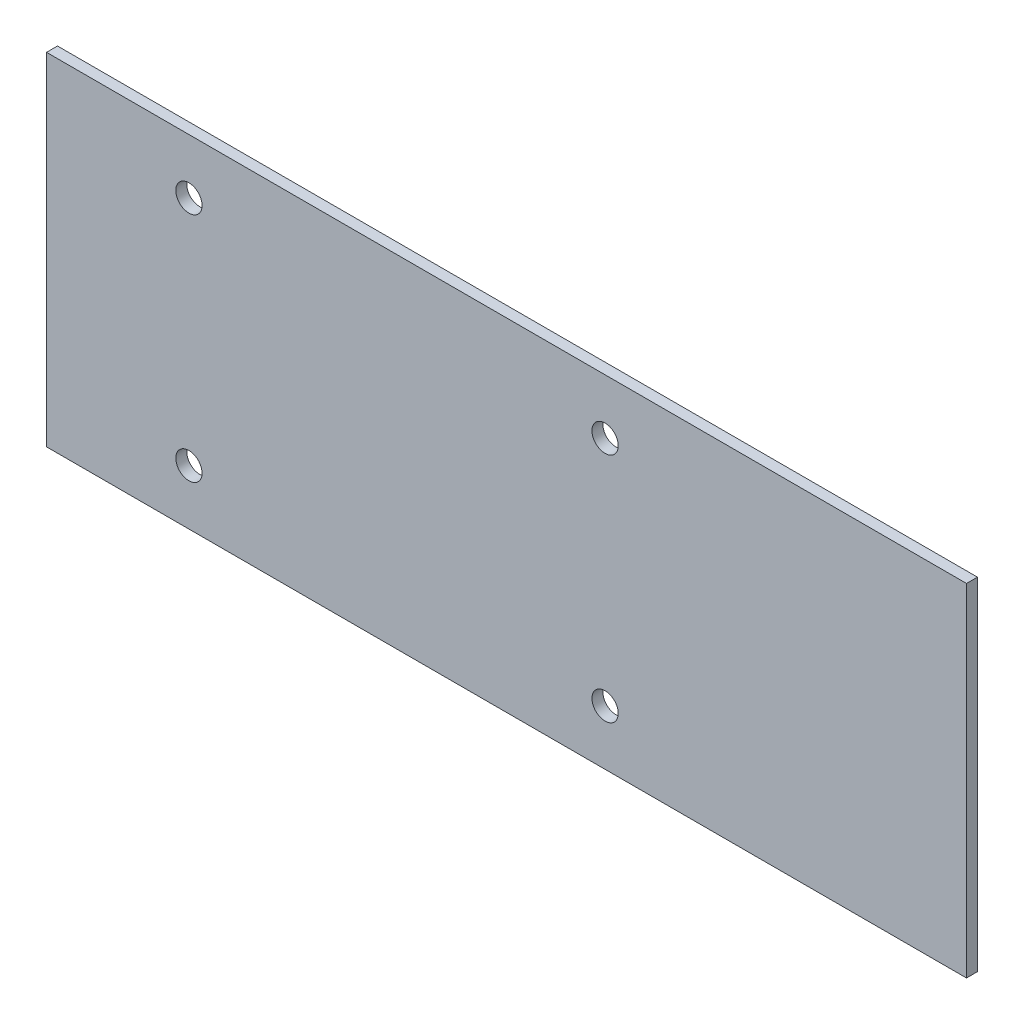
ISO-10303-21;
HEADER;
FILE_DESCRIPTION(('STEP AP214'),'2;1');
FILE_NAME('part.step','',(''),(''),'','','');
FILE_SCHEMA(('AUTOMOTIVE_DESIGN { 1 0 10303 214 1 1 1 1 }'));
ENDSEC;
DATA;
#1=APPLICATION_CONTEXT('core data for automotive mechanical design processes');
#2=APPLICATION_PROTOCOL_DEFINITION('international standard','automotive_design',2000,#1);
#3=PRODUCT_CONTEXT('',#1,'mechanical');
#4=PRODUCT('Part','Part','',(#3));
#5=PRODUCT_RELATED_PRODUCT_CATEGORY('part','',(#4));
#6=PRODUCT_DEFINITION_FORMATION('','',#4);
#7=PRODUCT_DEFINITION_CONTEXT('part definition',#1,'design');
#8=PRODUCT_DEFINITION('design','',#6,#7);
#9=PRODUCT_DEFINITION_SHAPE('','',#8);
#10=(LENGTH_UNIT() NAMED_UNIT(*) SI_UNIT(.MILLI.,.METRE.));
#11=(NAMED_UNIT(*) PLANE_ANGLE_UNIT() SI_UNIT($,.RADIAN.));
#12=(NAMED_UNIT(*) SI_UNIT($,.STERADIAN.) SOLID_ANGLE_UNIT());
#13=UNCERTAINTY_MEASURE_WITH_UNIT(LENGTH_MEASURE(1.E-05),#10,'distance_accuracy_value','');
#14=(GEOMETRIC_REPRESENTATION_CONTEXT(3) GLOBAL_UNCERTAINTY_ASSIGNED_CONTEXT((#13)) GLOBAL_UNIT_ASSIGNED_CONTEXT((#10,
#11,#12)) REPRESENTATION_CONTEXT('',''));
#15=CARTESIAN_POINT('',(0.,0.,0.));
#16=DIRECTION('',(0.,0.,1.));
#17=DIRECTION('',(1.,0.,0.));
#18=AXIS2_PLACEMENT_3D('',#15,#16,#17);
#19=CARTESIAN_POINT('',(0.,0.,5.));
#20=DIRECTION('',(0.,0.,1.));
#21=DIRECTION('',(1.,0.,0.));
#22=AXIS2_PLACEMENT_3D('',#19,#20,#21);
#23=PLANE('',#22);
#24=CARTESIAN_POINT('',(-165.,-52.92,5.));
#25=DIRECTION('',(0.,0.,1.));
#26=DIRECTION('',(1.,0.,0.));
#27=AXIS2_PLACEMENT_3D('',#24,#25,#26);
#28=CIRCLE('',#27,6.00000000000031);
#29=CARTESIAN_POINT('',(-159.,-52.92,5.));
#30=VERTEX_POINT('',#29);
#31=EDGE_CURVE('E121',#30,#30,#28,.T.);
#32=ORIENTED_EDGE('',*,*,#31,.F.);
#33=EDGE_LOOP('',(#32));
#34=FACE_BOUND('',#33,.T.);
#35=CARTESIAN_POINT('',(-355.,52.92,5.));
#36=DIRECTION('',(0.,0.,1.));
#37=DIRECTION('',(1.,0.,0.));
#38=AXIS2_PLACEMENT_3D('',#35,#36,#37);
#39=CIRCLE('',#38,6.00000000000034);
#40=CARTESIAN_POINT('',(-349.,52.92,5.));
#41=VERTEX_POINT('',#40);
#42=EDGE_CURVE('E100',#41,#41,#39,.T.);
#43=ORIENTED_EDGE('',*,*,#42,.F.);
#44=EDGE_LOOP('',(#43));
#45=FACE_BOUND('',#44,.T.);
#46=DIRECTION('',(0.,-1.,0.));
#47=VECTOR('',#46,1.);
#48=CARTESIAN_POINT('',(-420.,-78.,5.));
#49=LINE('',#48,#47);
#50=CARTESIAN_POINT('',(-420.,78.,5.));
#51=VERTEX_POINT('',#50);
#52=CARTESIAN_POINT('',(-420.,-78.,5.));
#53=VERTEX_POINT('',#52);
#54=EDGE_CURVE('E85',#51,#53,#49,.T.);
#55=ORIENTED_EDGE('',*,*,#54,.T.);
#56=DIRECTION('',(1.,0.,0.));
#57=VECTOR('',#56,1.);
#58=CARTESIAN_POINT('',(0.,-78.,5.));
#59=LINE('',#58,#57);
#60=CARTESIAN_POINT('',(0.,-78.,5.));
#61=VERTEX_POINT('',#60);
#62=EDGE_CURVE('E80',#53,#61,#59,.T.);
#63=ORIENTED_EDGE('',*,*,#62,.T.);
#64=DIRECTION('',(0.,1.,0.));
#65=VECTOR('',#64,1.);
#66=CARTESIAN_POINT('',(0.,-78.,5.));
#67=LINE('',#66,#65);
#68=CARTESIAN_POINT('',(0.,78.,5.));
#69=VERTEX_POINT('',#68);
#70=EDGE_CURVE('E83',#61,#69,#67,.T.);
#71=ORIENTED_EDGE('',*,*,#70,.T.);
#72=DIRECTION('',(-1.,0.,0.));
#73=VECTOR('',#72,1.);
#74=CARTESIAN_POINT('',(0.,78.,5.));
#75=LINE('',#74,#73);
#76=EDGE_CURVE('E50',#69,#51,#75,.T.);
#77=ORIENTED_EDGE('',*,*,#76,.T.);
#78=EDGE_LOOP('',(#55,#63,#71,#77));
#79=FACE_BOUND('',#78,.T.);
#80=CARTESIAN_POINT('',(-165.,52.92,5.));
#81=DIRECTION('',(0.,0.,1.));
#82=DIRECTION('',(1.,0.,0.));
#83=AXIS2_PLACEMENT_3D('',#80,#81,#82);
#84=CIRCLE('',#83,6.00000000000031);
#85=CARTESIAN_POINT('',(-159.,52.92,5.));
#86=VERTEX_POINT('',#85);
#87=EDGE_CURVE('E115',#86,#86,#84,.T.);
#88=ORIENTED_EDGE('',*,*,#87,.F.);
#89=EDGE_LOOP('',(#88));
#90=FACE_BOUND('',#89,.T.);
#91=CARTESIAN_POINT('',(-355.,-52.92,5.));
#92=DIRECTION('',(0.,0.,1.));
#93=DIRECTION('',(1.,0.,0.));
#94=AXIS2_PLACEMENT_3D('',#91,#92,#93);
#95=CIRCLE('',#94,6.00000000000034);
#96=CARTESIAN_POINT('',(-349.,-52.92,5.));
#97=VERTEX_POINT('',#96);
#98=EDGE_CURVE('E127',#97,#97,#95,.T.);
#99=ORIENTED_EDGE('',*,*,#98,.F.);
#100=EDGE_LOOP('',(#99));
#101=FACE_BOUND('',#100,.T.);
#102=ADVANCED_FACE('F33',(#34,#45,#79,#90,#101),#23,.T.);
#103=CARTESIAN_POINT('',(0.,0.,0.));
#104=DIRECTION('',(0.,0.,1.));
#105=DIRECTION('',(1.,0.,0.));
#106=AXIS2_PLACEMENT_3D('',#103,#104,#105);
#107=PLANE('',#106);
#108=DIRECTION('',(0.,-1.,0.));
#109=VECTOR('',#108,1.);
#110=CARTESIAN_POINT('',(-420.,-78.,0.));
#111=LINE('',#110,#109);
#112=CARTESIAN_POINT('',(-420.,78.,0.));
#113=VERTEX_POINT('',#112);
#114=CARTESIAN_POINT('',(-420.,-78.,0.));
#115=VERTEX_POINT('',#114);
#116=EDGE_CURVE('E97',#113,#115,#111,.T.);
#117=ORIENTED_EDGE('',*,*,#116,.F.);
#118=DIRECTION('',(-1.,0.,0.));
#119=VECTOR('',#118,1.);
#120=CARTESIAN_POINT('',(0.,78.,0.));
#121=LINE('',#120,#119);
#122=CARTESIAN_POINT('',(0.,78.,0.));
#123=VERTEX_POINT('',#122);
#124=EDGE_CURVE('E73',#123,#113,#121,.T.);
#125=ORIENTED_EDGE('',*,*,#124,.F.);
#126=DIRECTION('',(0.,1.,0.));
#127=VECTOR('',#126,1.);
#128=CARTESIAN_POINT('',(0.,-78.,0.));
#129=LINE('',#128,#127);
#130=CARTESIAN_POINT('',(0.,-78.,0.));
#131=VERTEX_POINT('',#130);
#132=EDGE_CURVE('E67',#131,#123,#129,.T.);
#133=ORIENTED_EDGE('',*,*,#132,.F.);
#134=DIRECTION('',(1.,0.,0.));
#135=VECTOR('',#134,1.);
#136=CARTESIAN_POINT('',(0.,-78.,0.));
#137=LINE('',#136,#135);
#138=EDGE_CURVE('E89',#115,#131,#137,.T.);
#139=ORIENTED_EDGE('',*,*,#138,.F.);
#140=EDGE_LOOP('',(#117,#125,#133,#139));
#141=FACE_BOUND('',#140,.T.);
#142=CARTESIAN_POINT('',(-355.,52.92,0.));
#143=DIRECTION('',(0.,0.,1.));
#144=DIRECTION('',(1.,0.,0.));
#145=AXIS2_PLACEMENT_3D('',#142,#143,#144);
#146=CIRCLE('',#145,6.00000000000034);
#147=CARTESIAN_POINT('',(-349.,52.92,0.));
#148=VERTEX_POINT('',#147);
#149=EDGE_CURVE('E112',#148,#148,#146,.T.);
#150=ORIENTED_EDGE('',*,*,#149,.T.);
#151=EDGE_LOOP('',(#150));
#152=FACE_BOUND('',#151,.T.);
#153=CARTESIAN_POINT('',(-165.,52.92,0.));
#154=DIRECTION('',(0.,0.,1.));
#155=DIRECTION('',(1.,0.,0.));
#156=AXIS2_PLACEMENT_3D('',#153,#154,#155);
#157=CIRCLE('',#156,6.00000000000031);
#158=CARTESIAN_POINT('',(-159.,52.92,0.));
#159=VERTEX_POINT('',#158);
#160=EDGE_CURVE('E118',#159,#159,#157,.T.);
#161=ORIENTED_EDGE('',*,*,#160,.T.);
#162=EDGE_LOOP('',(#161));
#163=FACE_BOUND('',#162,.T.);
#164=CARTESIAN_POINT('',(-165.,-52.92,0.));
#165=DIRECTION('',(0.,0.,1.));
#166=DIRECTION('',(1.,0.,0.));
#167=AXIS2_PLACEMENT_3D('',#164,#165,#166);
#168=CIRCLE('',#167,6.00000000000031);
#169=CARTESIAN_POINT('',(-159.,-52.92,0.));
#170=VERTEX_POINT('',#169);
#171=EDGE_CURVE('E124',#170,#170,#168,.T.);
#172=ORIENTED_EDGE('',*,*,#171,.T.);
#173=EDGE_LOOP('',(#172));
#174=FACE_BOUND('',#173,.T.);
#175=CARTESIAN_POINT('',(-355.,-52.92,0.));
#176=DIRECTION('',(0.,0.,1.));
#177=DIRECTION('',(1.,0.,0.));
#178=AXIS2_PLACEMENT_3D('',#175,#176,#177);
#179=CIRCLE('',#178,6.00000000000034);
#180=CARTESIAN_POINT('',(-349.,-52.92,0.));
#181=VERTEX_POINT('',#180);
#182=EDGE_CURVE('E130',#181,#181,#179,.T.);
#183=ORIENTED_EDGE('',*,*,#182,.T.);
#184=EDGE_LOOP('',(#183));
#185=FACE_BOUND('',#184,.T.);
#186=ADVANCED_FACE('F108',(#141,#152,#163,#174,#185),#107,.F.);
#187=CARTESIAN_POINT('',(-420.,-78.,5.));
#188=DIRECTION('',(1.,0.,0.));
#189=DIRECTION('',(0.,1.,0.));
#190=AXIS2_PLACEMENT_3D('',#187,#188,#189);
#191=PLANE('',#190);
#192=ORIENTED_EDGE('',*,*,#116,.T.);
#193=DIRECTION('',(0.,0.,-1.));
#194=VECTOR('',#193,1.);
#195=CARTESIAN_POINT('',(-420.,-78.,5.));
#196=LINE('',#195,#194);
#197=EDGE_CURVE('E11',#53,#115,#196,.T.);
#198=ORIENTED_EDGE('',*,*,#197,.F.);
#199=ORIENTED_EDGE('',*,*,#54,.F.);
#200=DIRECTION('',(0.,0.,-1.));
#201=VECTOR('',#200,1.);
#202=CARTESIAN_POINT('',(-420.,78.,5.));
#203=LINE('',#202,#201);
#204=EDGE_CURVE('E93',#51,#113,#203,.T.);
#205=ORIENTED_EDGE('',*,*,#204,.T.);
#206=EDGE_LOOP('',(#192,#198,#199,#205));
#207=FACE_BOUND('',#206,.T.);
#208=ADVANCED_FACE('F35',(#207),#191,.F.);
#209=CARTESIAN_POINT('',(0.,-78.,5.));
#210=DIRECTION('',(0.,1.,0.));
#211=DIRECTION('',(-1.,0.,0.));
#212=AXIS2_PLACEMENT_3D('',#209,#210,#211);
#213=PLANE('',#212);
#214=ORIENTED_EDGE('',*,*,#138,.T.);
#215=DIRECTION('',(0.,0.,-1.));
#216=VECTOR('',#215,1.);
#217=CARTESIAN_POINT('',(0.,-78.,5.));
#218=LINE('',#217,#216);
#219=EDGE_CURVE('E42',#61,#131,#218,.T.);
#220=ORIENTED_EDGE('',*,*,#219,.F.);
#221=ORIENTED_EDGE('',*,*,#62,.F.);
#222=ORIENTED_EDGE('',*,*,#197,.T.);
#223=EDGE_LOOP('',(#214,#220,#221,#222));
#224=FACE_BOUND('',#223,.T.);
#225=ADVANCED_FACE('F88',(#224),#213,.F.);
#226=CARTESIAN_POINT('',(0.,-78.,5.));
#227=DIRECTION('',(-1.,0.,0.));
#228=DIRECTION('',(0.,-1.,0.));
#229=AXIS2_PLACEMENT_3D('',#226,#227,#228);
#230=PLANE('',#229);
#231=ORIENTED_EDGE('',*,*,#132,.T.);
#232=DIRECTION('',(0.,0.,-1.));
#233=VECTOR('',#232,1.);
#234=CARTESIAN_POINT('',(0.,78.,5.));
#235=LINE('',#234,#233);
#236=EDGE_CURVE('E90',#69,#123,#235,.T.);
#237=ORIENTED_EDGE('',*,*,#236,.F.);
#238=ORIENTED_EDGE('',*,*,#70,.F.);
#239=ORIENTED_EDGE('',*,*,#219,.T.);
#240=EDGE_LOOP('',(#231,#237,#238,#239));
#241=FACE_BOUND('',#240,.T.);
#242=ADVANCED_FACE('F91',(#241),#230,.F.);
#243=CARTESIAN_POINT('',(0.,78.,5.));
#244=DIRECTION('',(0.,-1.,0.));
#245=DIRECTION('',(1.,0.,0.));
#246=AXIS2_PLACEMENT_3D('',#243,#244,#245);
#247=PLANE('',#246);
#248=ORIENTED_EDGE('',*,*,#124,.T.);
#249=ORIENTED_EDGE('',*,*,#204,.F.);
#250=ORIENTED_EDGE('',*,*,#76,.F.);
#251=ORIENTED_EDGE('',*,*,#236,.T.);
#252=EDGE_LOOP('',(#248,#249,#250,#251));
#253=FACE_BOUND('',#252,.T.);
#254=ADVANCED_FACE('F105',(#253),#247,.F.);
#255=CARTESIAN_POINT('',(-355.,52.92,5.));
#256=DIRECTION('',(0.,0.,-1.));
#257=DIRECTION('',(-1.,0.,0.));
#258=AXIS2_PLACEMENT_3D('',#255,#256,#257);
#259=CYLINDRICAL_SURFACE('',#258,6.00000000000034);
#260=ORIENTED_EDGE('',*,*,#42,.T.);
#261=EDGE_LOOP('',(#260));
#262=FACE_BOUND('',#261,.T.);
#263=ORIENTED_EDGE('',*,*,#149,.F.);
#264=EDGE_LOOP('',(#263));
#265=FACE_BOUND('',#264,.T.);
#266=ADVANCED_FACE('F149',(#262,#265),#259,.F.);
#267=CARTESIAN_POINT('',(-165.,52.92,5.));
#268=DIRECTION('',(0.,0.,-1.));
#269=DIRECTION('',(-1.,0.,0.));
#270=AXIS2_PLACEMENT_3D('',#267,#268,#269);
#271=CYLINDRICAL_SURFACE('',#270,6.00000000000031);
#272=ORIENTED_EDGE('',*,*,#87,.T.);
#273=EDGE_LOOP('',(#272));
#274=FACE_BOUND('',#273,.T.);
#275=ORIENTED_EDGE('',*,*,#160,.F.);
#276=EDGE_LOOP('',(#275));
#277=FACE_BOUND('',#276,.T.);
#278=ADVANCED_FACE('F195',(#274,#277),#271,.F.);
#279=CARTESIAN_POINT('',(-165.,-52.92,5.));
#280=DIRECTION('',(0.,0.,-1.));
#281=DIRECTION('',(-1.,0.,0.));
#282=AXIS2_PLACEMENT_3D('',#279,#280,#281);
#283=CYLINDRICAL_SURFACE('',#282,6.00000000000031);
#284=ORIENTED_EDGE('',*,*,#31,.T.);
#285=EDGE_LOOP('',(#284));
#286=FACE_BOUND('',#285,.T.);
#287=ORIENTED_EDGE('',*,*,#171,.F.);
#288=EDGE_LOOP('',(#287));
#289=FACE_BOUND('',#288,.T.);
#290=ADVANCED_FACE('F203',(#286,#289),#283,.F.);
#291=CARTESIAN_POINT('',(-355.,-52.92,5.));
#292=DIRECTION('',(0.,0.,-1.));
#293=DIRECTION('',(-1.,0.,0.));
#294=AXIS2_PLACEMENT_3D('',#291,#292,#293);
#295=CYLINDRICAL_SURFACE('',#294,6.00000000000034);
#296=ORIENTED_EDGE('',*,*,#98,.T.);
#297=EDGE_LOOP('',(#296));
#298=FACE_BOUND('',#297,.T.);
#299=ORIENTED_EDGE('',*,*,#182,.F.);
#300=EDGE_LOOP('',(#299));
#301=FACE_BOUND('',#300,.T.);
#302=ADVANCED_FACE('F136',(#298,#301),#295,.F.);
#303=CLOSED_SHELL('',(#102,#186,#208,#225,#242,#254,#266,#278,#290,#302));
#304=MANIFOLD_SOLID_BREP('B2',#303);
#305=ADVANCED_BREP_SHAPE_REPRESENTATION('',(#18,#304),#14);
#306=SHAPE_DEFINITION_REPRESENTATION(#9,#305);
ENDSEC;
END-ISO-10303-21;
